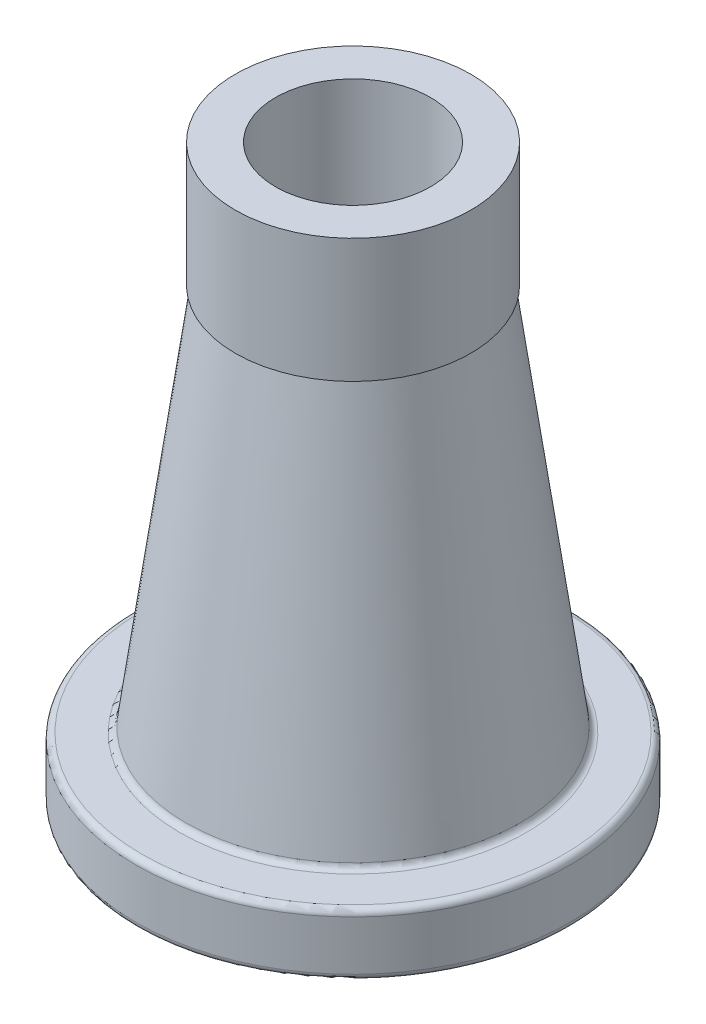
ISO-10303-21;
HEADER;
FILE_DESCRIPTION(('STEP AP214'),'2;1');
FILE_NAME('part.step','',(''),(''),'','','');
FILE_SCHEMA(('AUTOMOTIVE_DESIGN { 1 0 10303 214 1 1 1 1 }'));
ENDSEC;
DATA;
#1=APPLICATION_CONTEXT('core data for automotive mechanical design processes');
#2=APPLICATION_PROTOCOL_DEFINITION('international standard','automotive_design',2000,#1);
#3=PRODUCT_CONTEXT('',#1,'mechanical');
#4=PRODUCT('Part','Part','',(#3));
#5=PRODUCT_RELATED_PRODUCT_CATEGORY('part','',(#4));
#6=PRODUCT_DEFINITION_FORMATION('','',#4);
#7=PRODUCT_DEFINITION_CONTEXT('part definition',#1,'design');
#8=PRODUCT_DEFINITION('design','',#6,#7);
#9=PRODUCT_DEFINITION_SHAPE('','',#8);
#10=(LENGTH_UNIT() NAMED_UNIT(*) SI_UNIT(.MILLI.,.METRE.));
#11=(NAMED_UNIT(*) PLANE_ANGLE_UNIT() SI_UNIT($,.RADIAN.));
#12=(NAMED_UNIT(*) SI_UNIT($,.STERADIAN.) SOLID_ANGLE_UNIT());
#13=UNCERTAINTY_MEASURE_WITH_UNIT(LENGTH_MEASURE(1.E-05),#10,'distance_accuracy_value','');
#14=(GEOMETRIC_REPRESENTATION_CONTEXT(3) GLOBAL_UNCERTAINTY_ASSIGNED_CONTEXT((#13)) GLOBAL_UNIT_ASSIGNED_CONTEXT((#10,
#11,#12)) REPRESENTATION_CONTEXT('',''));
#15=CARTESIAN_POINT('',(0.,0.,0.));
#16=DIRECTION('',(0.,0.,1.));
#17=DIRECTION('',(1.,0.,0.));
#18=AXIS2_PLACEMENT_3D('',#15,#16,#17);
#19=CARTESIAN_POINT('',(0.,185.,0.));
#20=DIRECTION('',(0.,1.,0.));
#21=DIRECTION('',(0.,0.,1.));
#22=AXIS2_PLACEMENT_3D('',#19,#20,#21);
#23=CYLINDRICAL_SURFACE('',#22,70.);
#24=CARTESIAN_POINT('',(0.,18.,0.));
#25=DIRECTION('',(0.,1.,0.));
#26=DIRECTION('',(0.,0.,1.));
#27=AXIS2_PLACEMENT_3D('',#24,#25,#26);
#28=CIRCLE('',#27,70.);
#29=CARTESIAN_POINT('',(0.,18.,70.));
#30=VERTEX_POINT('',#29);
#31=EDGE_CURVE('E10',#30,#30,#28,.T.);
#32=ORIENTED_EDGE('',*,*,#31,.F.);
#33=EDGE_LOOP('',(#32));
#34=FACE_BOUND('',#33,.T.);
#35=CARTESIAN_POINT('',(0.,2.,0.));
#36=DIRECTION('',(0.,1.,0.));
#37=DIRECTION('',(0.,0.,1.));
#38=AXIS2_PLACEMENT_3D('',#35,#36,#37);
#39=CIRCLE('',#38,70.);
#40=CARTESIAN_POINT('',(0.,2.,70.));
#41=VERTEX_POINT('',#40);
#42=EDGE_CURVE('E89',#41,#41,#39,.T.);
#43=ORIENTED_EDGE('',*,*,#42,.T.);
#44=EDGE_LOOP('',(#43));
#45=FACE_BOUND('',#44,.T.);
#46=ADVANCED_FACE('F37',(#34,#45),#23,.T.);
#47=CARTESIAN_POINT('',(0.,18.,0.));
#48=DIRECTION('',(0.,1.,0.));
#49=DIRECTION('',(0.,0.,1.));
#50=AXIS2_PLACEMENT_3D('',#47,#48,#49);
#51=TOROIDAL_SURFACE('',#50,68.,2.);
#52=CARTESIAN_POINT('',(0.,20.,0.));
#53=DIRECTION('',(0.,1.,0.));
#54=DIRECTION('',(0.,0.,1.));
#55=AXIS2_PLACEMENT_3D('',#52,#53,#54);
#56=CIRCLE('',#55,68.);
#57=CARTESIAN_POINT('',(0.,20.,68.));
#58=VERTEX_POINT('',#57);
#59=EDGE_CURVE('E43',#58,#58,#56,.T.);
#60=ORIENTED_EDGE('',*,*,#59,.F.);
#61=EDGE_LOOP('',(#60));
#62=FACE_BOUND('',#61,.T.);
#63=ORIENTED_EDGE('',*,*,#31,.T.);
#64=EDGE_LOOP('',(#63));
#65=FACE_BOUND('',#64,.T.);
#66=ADVANCED_FACE('F124',(#62,#65),#51,.T.);
#67=CARTESIAN_POINT('',(0.,20.,0.));
#68=DIRECTION('',(0.,-1.,0.));
#69=DIRECTION('',(0.,0.,-1.));
#70=AXIS2_PLACEMENT_3D('',#67,#68,#69);
#71=PLANE('',#70);
#72=CARTESIAN_POINT('',(0.,20.,0.));
#73=DIRECTION('',(0.,1.,0.));
#74=DIRECTION('',(0.,0.,1.));
#75=AXIS2_PLACEMENT_3D('',#72,#73,#74);
#76=CIRCLE('',#75,55.8571969882731);
#77=CARTESIAN_POINT('',(0.,20.,55.8571969882731));
#78=VERTEX_POINT('',#77);
#79=EDGE_CURVE('E47',#78,#78,#76,.T.);
#80=ORIENTED_EDGE('',*,*,#79,.F.);
#81=EDGE_LOOP('',(#80));
#82=FACE_BOUND('',#81,.T.);
#83=ORIENTED_EDGE('',*,*,#59,.T.);
#84=EDGE_LOOP('',(#83));
#85=FACE_BOUND('',#84,.T.);
#86=ADVANCED_FACE('F129',(#82,#85),#71,.F.);
#87=CARTESIAN_POINT('',(0.,22.,0.));
#88=DIRECTION('',(0.,1.,0.));
#89=DIRECTION('',(0.,0.,1.));
#90=AXIS2_PLACEMENT_3D('',#87,#88,#89);
#91=TOROIDAL_SURFACE('',#90,55.8571969882731,2.);
#92=CARTESIAN_POINT('',(0.,21.7287327032895,0.));
#93=DIRECTION('',(0.,1.,0.));
#94=DIRECTION('',(0.,0.,1.));
#95=AXIS2_PLACEMENT_3D('',#92,#93,#94);
#96=CIRCLE('',#95,53.8756788698257);
#97=CARTESIAN_POINT('',(0.,21.7287327032895,53.8756788698257));
#98=VERTEX_POINT('',#97);
#99=EDGE_CURVE('E51',#98,#98,#96,.T.);
#100=ORIENTED_EDGE('',*,*,#99,.F.);
#101=EDGE_LOOP('',(#100));
#102=FACE_BOUND('',#101,.T.);
#103=ORIENTED_EDGE('',*,*,#79,.T.);
#104=EDGE_LOOP('',(#103));
#105=FACE_BOUND('',#104,.T.);
#106=ADVANCED_FACE('F134',(#102,#105),#91,.F.);
#107=CARTESIAN_POINT('',(0.,144.432183175822,0.));
#108=DIRECTION('',(0.,-1.,0.));
#109=DIRECTION('',(0.,0.,-1.));
#110=AXIS2_PLACEMENT_3D('',#107,#108,#109);
#111=CONICAL_SURFACE('',#110,37.0777333971804,0.136052992991687);
#112=ORIENTED_EDGE('',*,*,#99,.T.);
#113=EDGE_LOOP('',(#112));
#114=FACE_BOUND('',#113,.T.);
#115=CARTESIAN_POINT('',(0.,144.432183175822,0.));
#116=DIRECTION('',(0.,1.,0.));
#117=DIRECTION('',(0.,0.,1.));
#118=AXIS2_PLACEMENT_3D('',#115,#116,#117);
#119=CIRCLE('',#118,37.0777333971804);
#120=CARTESIAN_POINT('',(0.,144.432183175822,37.0777333971804));
#121=VERTEX_POINT('',#120);
#122=EDGE_CURVE('E56',#121,#121,#119,.T.);
#123=ORIENTED_EDGE('',*,*,#122,.F.);
#124=EDGE_LOOP('',(#123));
#125=FACE_BOUND('',#124,.T.);
#126=ADVANCED_FACE('F140',(#114,#125),#111,.T.);
#127=CARTESIAN_POINT('',(0.,144.5,0.));
#128=DIRECTION('',(0.,1.,0.));
#129=DIRECTION('',(0.,0.,1.));
#130=AXIS2_PLACEMENT_3D('',#127,#128,#129);
#131=TOROIDAL_SURFACE('',#130,37.5731129267922,0.500000000000011);
#132=CARTESIAN_POINT('',(0.,145.,0.));
#133=DIRECTION('',(0.,1.,0.));
#134=DIRECTION('',(0.,0.,1.));
#135=AXIS2_PLACEMENT_3D('',#132,#133,#134);
#136=CIRCLE('',#135,37.5731129267922);
#137=CARTESIAN_POINT('',(0.,145.,37.5731129267922));
#138=VERTEX_POINT('',#137);
#139=EDGE_CURVE('E59',#138,#138,#136,.T.);
#140=ORIENTED_EDGE('',*,*,#139,.F.);
#141=EDGE_LOOP('',(#140));
#142=FACE_BOUND('',#141,.T.);
#143=ORIENTED_EDGE('',*,*,#122,.T.);
#144=EDGE_LOOP('',(#143));
#145=FACE_BOUND('',#144,.T.);
#146=ADVANCED_FACE('F144',(#142,#145),#131,.F.);
#147=CARTESIAN_POINT('',(9.42768876561326E-12,145.,0.));
#148=DIRECTION('',(0.,-1.,0.));
#149=DIRECTION('',(0.,0.,-1.));
#150=AXIS2_PLACEMENT_3D('',#147,#148,#149);
#151=PLANE('',#150);
#152=ORIENTED_EDGE('',*,*,#139,.T.);
#153=EDGE_LOOP('',(#152));
#154=FACE_BOUND('',#153,.T.);
#155=CARTESIAN_POINT('',(0.,145.,0.));
#156=DIRECTION('',(0.,1.,0.));
#157=DIRECTION('',(0.,0.,1.));
#158=AXIS2_PLACEMENT_3D('',#155,#156,#157);
#159=CIRCLE('',#158,38.);
#160=CARTESIAN_POINT('',(0.,145.,38.));
#161=VERTEX_POINT('',#160);
#162=EDGE_CURVE('E62',#161,#161,#159,.T.);
#163=ORIENTED_EDGE('',*,*,#162,.F.);
#164=EDGE_LOOP('',(#163));
#165=FACE_BOUND('',#164,.T.);
#166=ADVANCED_FACE('F148',(#154,#165),#151,.T.);
#167=CARTESIAN_POINT('',(0.,185.,0.));
#168=DIRECTION('',(0.,1.,0.));
#169=DIRECTION('',(0.,0.,1.));
#170=AXIS2_PLACEMENT_3D('',#167,#168,#169);
#171=CYLINDRICAL_SURFACE('',#170,38.);
#172=ORIENTED_EDGE('',*,*,#162,.T.);
#173=EDGE_LOOP('',(#172));
#174=FACE_BOUND('',#173,.T.);
#175=CARTESIAN_POINT('',(0.,185.,0.));
#176=DIRECTION('',(0.,1.,0.));
#177=DIRECTION('',(0.,0.,1.));
#178=AXIS2_PLACEMENT_3D('',#175,#176,#177);
#179=CIRCLE('',#178,38.);
#180=CARTESIAN_POINT('',(0.,185.,38.));
#181=VERTEX_POINT('',#180);
#182=EDGE_CURVE('E65',#181,#181,#179,.T.);
#183=ORIENTED_EDGE('',*,*,#182,.F.);
#184=EDGE_LOOP('',(#183));
#185=FACE_BOUND('',#184,.T.);
#186=ADVANCED_FACE('F152',(#174,#185),#171,.T.);
#187=CARTESIAN_POINT('',(0.,185.,0.));
#188=DIRECTION('',(0.,1.,0.));
#189=DIRECTION('',(0.,0.,1.));
#190=AXIS2_PLACEMENT_3D('',#187,#188,#189);
#191=PLANE('',#190);
#192=ORIENTED_EDGE('',*,*,#182,.T.);
#193=EDGE_LOOP('',(#192));
#194=FACE_BOUND('',#193,.T.);
#195=CARTESIAN_POINT('',(0.,185.,0.));
#196=DIRECTION('',(0.,1.,0.));
#197=DIRECTION('',(0.,0.,1.));
#198=AXIS2_PLACEMENT_3D('',#195,#196,#197);
#199=CIRCLE('',#198,25.);
#200=CARTESIAN_POINT('',(0.,185.,25.));
#201=VERTEX_POINT('',#200);
#202=EDGE_CURVE('E68',#201,#201,#199,.T.);
#203=ORIENTED_EDGE('',*,*,#202,.F.);
#204=EDGE_LOOP('',(#203));
#205=FACE_BOUND('',#204,.T.);
#206=ADVANCED_FACE('F156',(#194,#205),#191,.T.);
#207=CARTESIAN_POINT('',(0.,185.,0.));
#208=DIRECTION('',(0.,1.,0.));
#209=DIRECTION('',(0.,0.,1.));
#210=AXIS2_PLACEMENT_3D('',#207,#208,#209);
#211=CYLINDRICAL_SURFACE('',#210,25.);
#212=CARTESIAN_POINT('',(0.,145.,0.));
#213=DIRECTION('',(0.,1.,0.));
#214=DIRECTION('',(0.,0.,1.));
#215=AXIS2_PLACEMENT_3D('',#212,#213,#214);
#216=CIRCLE('',#215,25.);
#217=CARTESIAN_POINT('',(0.,145.,25.));
#218=VERTEX_POINT('',#217);
#219=EDGE_CURVE('E71',#218,#218,#216,.T.);
#220=ORIENTED_EDGE('',*,*,#219,.F.);
#221=EDGE_LOOP('',(#220));
#222=FACE_BOUND('',#221,.T.);
#223=ORIENTED_EDGE('',*,*,#202,.T.);
#224=EDGE_LOOP('',(#223));
#225=FACE_BOUND('',#224,.T.);
#226=ADVANCED_FACE('F160',(#222,#225),#211,.F.);
#227=CARTESIAN_POINT('',(0.,145.,0.));
#228=DIRECTION('',(0.,-1.,0.));
#229=DIRECTION('',(0.,0.,-1.));
#230=AXIS2_PLACEMENT_3D('',#227,#228,#229);
#231=CONICAL_SURFACE('',#230,25.,0.133012786876509);
#232=CARTESIAN_POINT('',(0.,3.,0.));
#233=DIRECTION('',(0.,1.,0.));
#234=DIRECTION('',(0.,0.,1.));
#235=AXIS2_PLACEMENT_3D('',#232,#233,#234);
#236=CIRCLE('',#235,44.);
#237=CARTESIAN_POINT('',(0.,3.,44.));
#238=VERTEX_POINT('',#237);
#239=EDGE_CURVE('E74',#238,#238,#236,.T.);
#240=ORIENTED_EDGE('',*,*,#239,.F.);
#241=EDGE_LOOP('',(#240));
#242=FACE_BOUND('',#241,.T.);
#243=ORIENTED_EDGE('',*,*,#219,.T.);
#244=EDGE_LOOP('',(#243));
#245=FACE_BOUND('',#244,.T.);
#246=ADVANCED_FACE('F120',(#242,#245),#231,.F.);
#247=CARTESIAN_POINT('',(0.,3.,0.));
#248=DIRECTION('',(0.,1.,0.));
#249=DIRECTION('',(0.,0.,1.));
#250=AXIS2_PLACEMENT_3D('',#247,#248,#249);
#251=PLANE('',#250);
#252=CARTESIAN_POINT('',(0.,3.,0.));
#253=DIRECTION('',(0.,1.,0.));
#254=DIRECTION('',(0.,0.,1.));
#255=AXIS2_PLACEMENT_3D('',#252,#253,#254);
#256=CIRCLE('',#255,48.);
#257=CARTESIAN_POINT('',(0.,3.,48.));
#258=VERTEX_POINT('',#257);
#259=EDGE_CURVE('E77',#258,#258,#256,.T.);
#260=ORIENTED_EDGE('',*,*,#259,.F.);
#261=EDGE_LOOP('',(#260));
#262=FACE_BOUND('',#261,.T.);
#263=ORIENTED_EDGE('',*,*,#239,.T.);
#264=EDGE_LOOP('',(#263));
#265=FACE_BOUND('',#264,.T.);
#266=ADVANCED_FACE('F114',(#262,#265),#251,.F.);
#267=CARTESIAN_POINT('',(0.,1.,0.));
#268=DIRECTION('',(0.,1.,0.));
#269=DIRECTION('',(0.,0.,1.));
#270=AXIS2_PLACEMENT_3D('',#267,#268,#269);
#271=TOROIDAL_SURFACE('',#270,48.,2.);
#272=ORIENTED_EDGE('',*,*,#259,.T.);
#273=EDGE_LOOP('',(#272));
#274=FACE_BOUND('',#273,.T.);
#275=CARTESIAN_POINT('',(0.,0.999999999999973,0.));
#276=DIRECTION('',(0.,1.,0.));
#277=DIRECTION('',(0.,0.,1.));
#278=AXIS2_PLACEMENT_3D('',#275,#276,#277);
#279=CIRCLE('',#278,50.);
#280=CARTESIAN_POINT('',(0.,0.999999999999973,50.));
#281=VERTEX_POINT('',#280);
#282=EDGE_CURVE('E80',#281,#281,#279,.T.);
#283=ORIENTED_EDGE('',*,*,#282,.F.);
#284=EDGE_LOOP('',(#283));
#285=FACE_BOUND('',#284,.T.);
#286=ADVANCED_FACE('F109',(#274,#285),#271,.F.);
#287=CARTESIAN_POINT('',(0.,185.,0.));
#288=DIRECTION('',(0.,1.,0.));
#289=DIRECTION('',(0.,0.,1.));
#290=AXIS2_PLACEMENT_3D('',#287,#288,#289);
#291=CYLINDRICAL_SURFACE('',#290,50.);
#292=CARTESIAN_POINT('',(0.,0.,0.));
#293=DIRECTION('',(0.,1.,0.));
#294=DIRECTION('',(0.,0.,1.));
#295=AXIS2_PLACEMENT_3D('',#292,#293,#294);
#296=CIRCLE('',#295,50.);
#297=CARTESIAN_POINT('',(0.,0.,50.));
#298=VERTEX_POINT('',#297);
#299=EDGE_CURVE('E83',#298,#298,#296,.T.);
#300=ORIENTED_EDGE('',*,*,#299,.F.);
#301=EDGE_LOOP('',(#300));
#302=FACE_BOUND('',#301,.T.);
#303=ORIENTED_EDGE('',*,*,#282,.T.);
#304=EDGE_LOOP('',(#303));
#305=FACE_BOUND('',#304,.T.);
#306=ADVANCED_FACE('F103',(#302,#305),#291,.F.);
#307=CARTESIAN_POINT('',(0.,0.,0.));
#308=DIRECTION('',(0.,1.,0.));
#309=DIRECTION('',(0.,0.,1.));
#310=AXIS2_PLACEMENT_3D('',#307,#308,#309);
#311=PLANE('',#310);
#312=CARTESIAN_POINT('',(0.,0.,0.));
#313=DIRECTION('',(0.,1.,0.));
#314=DIRECTION('',(0.,0.,1.));
#315=AXIS2_PLACEMENT_3D('',#312,#313,#314);
#316=CIRCLE('',#315,68.);
#317=CARTESIAN_POINT('',(0.,0.,68.));
#318=VERTEX_POINT('',#317);
#319=EDGE_CURVE('E86',#318,#318,#316,.T.);
#320=ORIENTED_EDGE('',*,*,#319,.F.);
#321=EDGE_LOOP('',(#320));
#322=FACE_BOUND('',#321,.T.);
#323=ORIENTED_EDGE('',*,*,#299,.T.);
#324=EDGE_LOOP('',(#323));
#325=FACE_BOUND('',#324,.T.);
#326=ADVANCED_FACE('F97',(#322,#325),#311,.F.);
#327=CARTESIAN_POINT('',(0.,2.,0.));
#328=DIRECTION('',(0.,1.,0.));
#329=DIRECTION('',(0.,0.,1.));
#330=AXIS2_PLACEMENT_3D('',#327,#328,#329);
#331=TOROIDAL_SURFACE('',#330,68.,2.);
#332=ORIENTED_EDGE('',*,*,#42,.F.);
#333=EDGE_LOOP('',(#332));
#334=FACE_BOUND('',#333,.T.);
#335=ORIENTED_EDGE('',*,*,#319,.T.);
#336=EDGE_LOOP('',(#335));
#337=FACE_BOUND('',#336,.T.);
#338=ADVANCED_FACE('F94',(#334,#337),#331,.T.);
#339=CLOSED_SHELL('',(#46,#66,#86,#106,#126,#146,#166,#186,#206,#226,#246,#266,#286,#306,#326,#338));
#340=MANIFOLD_SOLID_BREP('B2',#339);
#341=ADVANCED_BREP_SHAPE_REPRESENTATION('',(#18,#340),#14);
#342=SHAPE_DEFINITION_REPRESENTATION(#9,#341);
ENDSEC;
END-ISO-10303-21;
